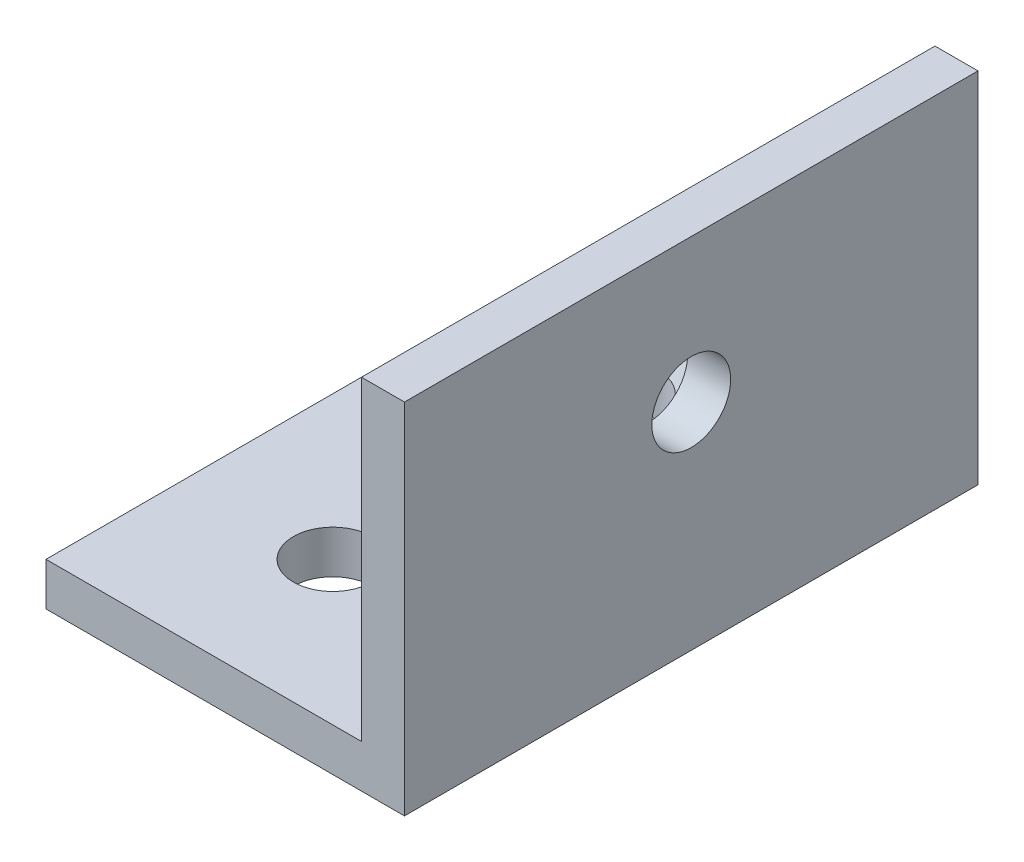
ISO-10303-21;
HEADER;
FILE_DESCRIPTION(('STEP AP214'),'2;1');
FILE_NAME('part.step','',(''),(''),'','','');
FILE_SCHEMA(('AUTOMOTIVE_DESIGN { 1 0 10303 214 1 1 1 1 }'));
ENDSEC;
DATA;
#1=APPLICATION_CONTEXT('core data for automotive mechanical design processes');
#2=APPLICATION_PROTOCOL_DEFINITION('international standard','automotive_design',2000,#1);
#3=PRODUCT_CONTEXT('',#1,'mechanical');
#4=PRODUCT('Part','Part','',(#3));
#5=PRODUCT_RELATED_PRODUCT_CATEGORY('part','',(#4));
#6=PRODUCT_DEFINITION_FORMATION('','',#4);
#7=PRODUCT_DEFINITION_CONTEXT('part definition',#1,'design');
#8=PRODUCT_DEFINITION('design','',#6,#7);
#9=PRODUCT_DEFINITION_SHAPE('','',#8);
#10=(LENGTH_UNIT() NAMED_UNIT(*) SI_UNIT(.MILLI.,.METRE.));
#11=(NAMED_UNIT(*) PLANE_ANGLE_UNIT() SI_UNIT($,.RADIAN.));
#12=(NAMED_UNIT(*) SI_UNIT($,.STERADIAN.) SOLID_ANGLE_UNIT());
#13=UNCERTAINTY_MEASURE_WITH_UNIT(LENGTH_MEASURE(1.E-05),#10,'distance_accuracy_value','');
#14=(GEOMETRIC_REPRESENTATION_CONTEXT(3) GLOBAL_UNCERTAINTY_ASSIGNED_CONTEXT((#13)) GLOBAL_UNIT_ASSIGNED_CONTEXT((#10,
#11,#12)) REPRESENTATION_CONTEXT('',''));
#15=CARTESIAN_POINT('',(0.,0.,0.));
#16=DIRECTION('',(0.,0.,1.));
#17=DIRECTION('',(1.,0.,0.));
#18=AXIS2_PLACEMENT_3D('',#15,#16,#17);
#19=CARTESIAN_POINT('',(-25.,0.,40.));
#20=DIRECTION('',(0.,1.,0.));
#21=DIRECTION('',(0.,0.,1.));
#22=AXIS2_PLACEMENT_3D('',#19,#20,#21);
#23=PLANE('',#22);
#24=CARTESIAN_POINT('',(-15.,0.,10.));
#25=DIRECTION('',(0.,1.,0.));
#26=DIRECTION('',(-1.,0.,0.));
#27=AXIS2_PLACEMENT_3D('',#24,#25,#26);
#28=CIRCLE('',#27,2.75);
#29=CARTESIAN_POINT('',(-17.75,0.,10.));
#30=VERTEX_POINT('',#29);
#31=EDGE_CURVE('E133',#30,#30,#28,.T.);
#32=ORIENTED_EDGE('',*,*,#31,.T.);
#33=EDGE_LOOP('',(#32));
#34=FACE_BOUND('',#33,.T.);
#35=CARTESIAN_POINT('',(-15.,0.,30.));
#36=DIRECTION('',(0.,1.,0.));
#37=DIRECTION('',(1.,0.,0.));
#38=AXIS2_PLACEMENT_3D('',#35,#36,#37);
#39=CIRCLE('',#38,2.75);
#40=CARTESIAN_POINT('',(-12.25,0.,30.));
#41=VERTEX_POINT('',#40);
#42=EDGE_CURVE('E185',#41,#41,#39,.T.);
#43=ORIENTED_EDGE('',*,*,#42,.T.);
#44=EDGE_LOOP('',(#43));
#45=FACE_BOUND('',#44,.T.);
#46=DIRECTION('',(1.,0.,0.));
#47=VECTOR('',#46,1.);
#48=CARTESIAN_POINT('',(-25.,0.,0.));
#49=LINE('',#48,#47);
#50=CARTESIAN_POINT('',(-25.,0.,0.));
#51=VERTEX_POINT('',#50);
#52=CARTESIAN_POINT('',(0.,0.,0.));
#53=VERTEX_POINT('',#52);
#54=EDGE_CURVE('E128',#51,#53,#49,.T.);
#55=ORIENTED_EDGE('',*,*,#54,.T.);
#56=DIRECTION('',(0.,0.,-1.));
#57=VECTOR('',#56,1.);
#58=CARTESIAN_POINT('',(0.,0.,40.));
#59=LINE('',#58,#57);
#60=CARTESIAN_POINT('',(0.,0.,40.));
#61=VERTEX_POINT('',#60);
#62=EDGE_CURVE('E11',#61,#53,#59,.T.);
#63=ORIENTED_EDGE('',*,*,#62,.F.);
#64=DIRECTION('',(1.,0.,0.));
#65=VECTOR('',#64,1.);
#66=CARTESIAN_POINT('',(-25.,0.,40.));
#67=LINE('',#66,#65);
#68=CARTESIAN_POINT('',(-25.,0.,40.));
#69=VERTEX_POINT('',#68);
#70=EDGE_CURVE('E145',#69,#61,#67,.T.);
#71=ORIENTED_EDGE('',*,*,#70,.F.);
#72=DIRECTION('',(0.,0.,-1.));
#73=VECTOR('',#72,1.);
#74=CARTESIAN_POINT('',(-25.,0.,40.));
#75=LINE('',#74,#73);
#76=EDGE_CURVE('E124',#69,#51,#75,.T.);
#77=ORIENTED_EDGE('',*,*,#76,.T.);
#78=EDGE_LOOP('',(#55,#63,#71,#77));
#79=FACE_BOUND('',#78,.T.);
#80=ADVANCED_FACE('F39',(#34,#45,#79),#23,.F.);
#81=CARTESIAN_POINT('',(0.,0.,40.));
#82=DIRECTION('',(-1.,0.,0.));
#83=DIRECTION('',(0.,0.,1.));
#84=AXIS2_PLACEMENT_3D('',#81,#82,#83);
#85=PLANE('',#84);
#86=CARTESIAN_POINT('',(0.,15.,20.));
#87=DIRECTION('',(-1.,0.,0.));
#88=DIRECTION('',(0.,0.,1.));
#89=AXIS2_PLACEMENT_3D('',#86,#87,#88);
#90=CIRCLE('',#89,2.75);
#91=CARTESIAN_POINT('',(0.,15.,22.75));
#92=VERTEX_POINT('',#91);
#93=EDGE_CURVE('E196',#92,#92,#90,.T.);
#94=ORIENTED_EDGE('',*,*,#93,.T.);
#95=EDGE_LOOP('',(#94));
#96=FACE_BOUND('',#95,.T.);
#97=DIRECTION('',(0.,1.,0.));
#98=VECTOR('',#97,1.);
#99=CARTESIAN_POINT('',(0.,0.,0.));
#100=LINE('',#99,#98);
#101=CARTESIAN_POINT('',(0.,25.,0.));
#102=VERTEX_POINT('',#101);
#103=EDGE_CURVE('E132',#53,#102,#100,.T.);
#104=ORIENTED_EDGE('',*,*,#103,.T.);
#105=DIRECTION('',(0.,0.,-1.));
#106=VECTOR('',#105,1.);
#107=CARTESIAN_POINT('',(0.,25.,40.));
#108=LINE('',#107,#106);
#109=CARTESIAN_POINT('',(0.,25.,40.));
#110=VERTEX_POINT('',#109);
#111=EDGE_CURVE('E48',#110,#102,#108,.T.);
#112=ORIENTED_EDGE('',*,*,#111,.F.);
#113=DIRECTION('',(0.,1.,0.));
#114=VECTOR('',#113,1.);
#115=CARTESIAN_POINT('',(0.,0.,40.));
#116=LINE('',#115,#114);
#117=EDGE_CURVE('E93',#61,#110,#116,.T.);
#118=ORIENTED_EDGE('',*,*,#117,.F.);
#119=ORIENTED_EDGE('',*,*,#62,.T.);
#120=EDGE_LOOP('',(#104,#112,#118,#119));
#121=FACE_BOUND('',#120,.T.);
#122=ADVANCED_FACE('F174',(#96,#121),#85,.F.);
#123=CARTESIAN_POINT('',(0.,25.,40.));
#124=DIRECTION('',(0.,-1.,0.));
#125=DIRECTION('',(0.,0.,-1.));
#126=AXIS2_PLACEMENT_3D('',#123,#124,#125);
#127=PLANE('',#126);
#128=DIRECTION('',(-1.,0.,0.));
#129=VECTOR('',#128,1.);
#130=CARTESIAN_POINT('',(0.,25.,0.));
#131=LINE('',#130,#129);
#132=CARTESIAN_POINT('',(-3.,25.,0.));
#133=VERTEX_POINT('',#132);
#134=EDGE_CURVE('E136',#102,#133,#131,.T.);
#135=ORIENTED_EDGE('',*,*,#134,.T.);
#136=DIRECTION('',(0.,0.,-1.));
#137=VECTOR('',#136,1.);
#138=CARTESIAN_POINT('',(-3.,25.,40.));
#139=LINE('',#138,#137);
#140=CARTESIAN_POINT('',(-3.,25.,40.));
#141=VERTEX_POINT('',#140);
#142=EDGE_CURVE('E117',#141,#133,#139,.T.);
#143=ORIENTED_EDGE('',*,*,#142,.F.);
#144=DIRECTION('',(-1.,0.,0.));
#145=VECTOR('',#144,1.);
#146=CARTESIAN_POINT('',(0.,25.,40.));
#147=LINE('',#146,#145);
#148=EDGE_CURVE('E106',#110,#141,#147,.T.);
#149=ORIENTED_EDGE('',*,*,#148,.F.);
#150=ORIENTED_EDGE('',*,*,#111,.T.);
#151=EDGE_LOOP('',(#135,#143,#149,#150));
#152=FACE_BOUND('',#151,.T.);
#153=ADVANCED_FACE('F155',(#152),#127,.F.);
#154=CARTESIAN_POINT('',(-3.,25.,40.));
#155=DIRECTION('',(1.,0.,0.));
#156=DIRECTION('',(0.,1.,0.));
#157=AXIS2_PLACEMENT_3D('',#154,#155,#156);
#158=PLANE('',#157);
#159=CARTESIAN_POINT('',(-3.,15.,20.));
#160=DIRECTION('',(-1.,0.,0.));
#161=DIRECTION('',(0.,0.,1.));
#162=AXIS2_PLACEMENT_3D('',#159,#160,#161);
#163=CIRCLE('',#162,2.75);
#164=CARTESIAN_POINT('',(-3.,15.,22.75));
#165=VERTEX_POINT('',#164);
#166=EDGE_CURVE('E209',#165,#165,#163,.T.);
#167=ORIENTED_EDGE('',*,*,#166,.F.);
#168=EDGE_LOOP('',(#167));
#169=FACE_BOUND('',#168,.T.);
#170=DIRECTION('',(0.,-1.,0.));
#171=VECTOR('',#170,1.);
#172=CARTESIAN_POINT('',(-3.,25.,0.));
#173=LINE('',#172,#171);
#174=CARTESIAN_POINT('',(-3.,3.,0.));
#175=VERTEX_POINT('',#174);
#176=EDGE_CURVE('E115',#133,#175,#173,.T.);
#177=ORIENTED_EDGE('',*,*,#176,.T.);
#178=DIRECTION('',(0.,0.,-1.));
#179=VECTOR('',#178,1.);
#180=CARTESIAN_POINT('',(-3.,3.,40.));
#181=LINE('',#180,#179);
#182=CARTESIAN_POINT('',(-3.,3.,40.));
#183=VERTEX_POINT('',#182);
#184=EDGE_CURVE('E112',#183,#175,#181,.T.);
#185=ORIENTED_EDGE('',*,*,#184,.F.);
#186=DIRECTION('',(0.,-1.,0.));
#187=VECTOR('',#186,1.);
#188=CARTESIAN_POINT('',(-3.,25.,40.));
#189=LINE('',#188,#187);
#190=EDGE_CURVE('E100',#141,#183,#189,.T.);
#191=ORIENTED_EDGE('',*,*,#190,.F.);
#192=ORIENTED_EDGE('',*,*,#142,.T.);
#193=EDGE_LOOP('',(#177,#185,#191,#192));
#194=FACE_BOUND('',#193,.T.);
#195=ADVANCED_FACE('F113',(#169,#194),#158,.F.);
#196=CARTESIAN_POINT('',(-3.,3.,40.));
#197=DIRECTION('',(0.,-1.,0.));
#198=DIRECTION('',(1.,0.,0.));
#199=AXIS2_PLACEMENT_3D('',#196,#197,#198);
#200=PLANE('',#199);
#201=CARTESIAN_POINT('',(-15.,3.,10.));
#202=DIRECTION('',(0.,1.,0.));
#203=DIRECTION('',(-1.,0.,0.));
#204=AXIS2_PLACEMENT_3D('',#201,#202,#203);
#205=CIRCLE('',#204,2.75);
#206=CARTESIAN_POINT('',(-17.75,3.,10.));
#207=VERTEX_POINT('',#206);
#208=EDGE_CURVE('E188',#207,#207,#205,.T.);
#209=ORIENTED_EDGE('',*,*,#208,.F.);
#210=EDGE_LOOP('',(#209));
#211=FACE_BOUND('',#210,.T.);
#212=CARTESIAN_POINT('',(-15.,3.,30.));
#213=DIRECTION('',(0.,1.,0.));
#214=DIRECTION('',(1.,0.,0.));
#215=AXIS2_PLACEMENT_3D('',#212,#213,#214);
#216=CIRCLE('',#215,2.75);
#217=CARTESIAN_POINT('',(-12.25,3.,30.));
#218=VERTEX_POINT('',#217);
#219=EDGE_CURVE('E189',#218,#218,#216,.T.);
#220=ORIENTED_EDGE('',*,*,#219,.F.);
#221=EDGE_LOOP('',(#220));
#222=FACE_BOUND('',#221,.T.);
#223=DIRECTION('',(-1.,0.,0.));
#224=VECTOR('',#223,1.);
#225=CARTESIAN_POINT('',(-3.,3.,0.));
#226=LINE('',#225,#224);
#227=CARTESIAN_POINT('',(-25.,3.,0.));
#228=VERTEX_POINT('',#227);
#229=EDGE_CURVE('E79',#175,#228,#226,.T.);
#230=ORIENTED_EDGE('',*,*,#229,.T.);
#231=DIRECTION('',(0.,0.,-1.));
#232=VECTOR('',#231,1.);
#233=CARTESIAN_POINT('',(-25.,3.,40.));
#234=LINE('',#233,#232);
#235=CARTESIAN_POINT('',(-25.,3.,40.));
#236=VERTEX_POINT('',#235);
#237=EDGE_CURVE('E118',#236,#228,#234,.T.);
#238=ORIENTED_EDGE('',*,*,#237,.F.);
#239=DIRECTION('',(-1.,0.,0.));
#240=VECTOR('',#239,1.);
#241=CARTESIAN_POINT('',(-3.,3.,40.));
#242=LINE('',#241,#240);
#243=EDGE_CURVE('E104',#183,#236,#242,.T.);
#244=ORIENTED_EDGE('',*,*,#243,.F.);
#245=ORIENTED_EDGE('',*,*,#184,.T.);
#246=EDGE_LOOP('',(#230,#238,#244,#245));
#247=FACE_BOUND('',#246,.T.);
#248=ADVANCED_FACE('F120',(#211,#222,#247),#200,.F.);
#249=CARTESIAN_POINT('',(-25.,3.,40.));
#250=DIRECTION('',(1.,0.,0.));
#251=DIRECTION('',(0.,0.,-1.));
#252=AXIS2_PLACEMENT_3D('',#249,#250,#251);
#253=PLANE('',#252);
#254=DIRECTION('',(0.,-1.,0.));
#255=VECTOR('',#254,1.);
#256=CARTESIAN_POINT('',(-25.,3.,0.));
#257=LINE('',#256,#255);
#258=EDGE_CURVE('E85',#228,#51,#257,.T.);
#259=ORIENTED_EDGE('',*,*,#258,.T.);
#260=ORIENTED_EDGE('',*,*,#76,.F.);
#261=DIRECTION('',(0.,-1.,0.));
#262=VECTOR('',#261,1.);
#263=CARTESIAN_POINT('',(-25.,3.,40.));
#264=LINE('',#263,#262);
#265=EDGE_CURVE('E56',#236,#69,#264,.T.);
#266=ORIENTED_EDGE('',*,*,#265,.F.);
#267=ORIENTED_EDGE('',*,*,#237,.T.);
#268=EDGE_LOOP('',(#259,#260,#266,#267));
#269=FACE_BOUND('',#268,.T.);
#270=ADVANCED_FACE('F162',(#269),#253,.F.);
#271=CARTESIAN_POINT('',(0.,0.,40.));
#272=DIRECTION('',(0.,0.,1.));
#273=DIRECTION('',(1.,0.,0.));
#274=AXIS2_PLACEMENT_3D('',#271,#272,#273);
#275=PLANE('',#274);
#276=ORIENTED_EDGE('',*,*,#70,.T.);
#277=ORIENTED_EDGE('',*,*,#117,.T.);
#278=ORIENTED_EDGE('',*,*,#148,.T.);
#279=ORIENTED_EDGE('',*,*,#190,.T.);
#280=ORIENTED_EDGE('',*,*,#243,.T.);
#281=ORIENTED_EDGE('',*,*,#265,.T.);
#282=EDGE_LOOP('',(#276,#277,#278,#279,#280,#281));
#283=FACE_BOUND('',#282,.T.);
#284=ADVANCED_FACE('F102',(#283),#275,.T.);
#285=CARTESIAN_POINT('',(0.,0.,0.));
#286=DIRECTION('',(0.,0.,1.));
#287=DIRECTION('',(1.,0.,0.));
#288=AXIS2_PLACEMENT_3D('',#285,#286,#287);
#289=PLANE('',#288);
#290=ORIENTED_EDGE('',*,*,#54,.F.);
#291=ORIENTED_EDGE('',*,*,#258,.F.);
#292=ORIENTED_EDGE('',*,*,#229,.F.);
#293=ORIENTED_EDGE('',*,*,#176,.F.);
#294=ORIENTED_EDGE('',*,*,#134,.F.);
#295=ORIENTED_EDGE('',*,*,#103,.F.);
#296=EDGE_LOOP('',(#290,#291,#292,#293,#294,#295));
#297=FACE_BOUND('',#296,.T.);
#298=ADVANCED_FACE('F158',(#297),#289,.F.);
#299=CARTESIAN_POINT('',(-15.,0.,30.));
#300=DIRECTION('',(0.,1.,0.));
#301=DIRECTION('',(-1.,0.,0.));
#302=AXIS2_PLACEMENT_3D('',#299,#300,#301);
#303=CYLINDRICAL_SURFACE('',#302,2.75);
#304=ORIENTED_EDGE('',*,*,#42,.F.);
#305=EDGE_LOOP('',(#304));
#306=FACE_BOUND('',#305,.T.);
#307=ORIENTED_EDGE('',*,*,#219,.T.);
#308=EDGE_LOOP('',(#307));
#309=FACE_BOUND('',#308,.T.);
#310=ADVANCED_FACE('F255',(#306,#309),#303,.F.);
#311=CARTESIAN_POINT('',(-15.,0.,10.));
#312=DIRECTION('',(0.,1.,0.));
#313=DIRECTION('',(-1.,0.,0.));
#314=AXIS2_PLACEMENT_3D('',#311,#312,#313);
#315=CYLINDRICAL_SURFACE('',#314,2.75);
#316=ORIENTED_EDGE('',*,*,#31,.F.);
#317=EDGE_LOOP('',(#316));
#318=FACE_BOUND('',#317,.T.);
#319=ORIENTED_EDGE('',*,*,#208,.T.);
#320=EDGE_LOOP('',(#319));
#321=FACE_BOUND('',#320,.T.);
#322=ADVANCED_FACE('F234',(#318,#321),#315,.F.);
#323=CARTESIAN_POINT('',(-3.,15.,20.));
#324=DIRECTION('',(-1.,0.,0.));
#325=DIRECTION('',(0.,0.,1.));
#326=AXIS2_PLACEMENT_3D('',#323,#324,#325);
#327=CYLINDRICAL_SURFACE('',#326,2.75);
#328=ORIENTED_EDGE('',*,*,#93,.F.);
#329=EDGE_LOOP('',(#328));
#330=FACE_BOUND('',#329,.T.);
#331=ORIENTED_EDGE('',*,*,#166,.T.);
#332=EDGE_LOOP('',(#331));
#333=FACE_BOUND('',#332,.T.);
#334=ADVANCED_FACE('F214',(#330,#333),#327,.F.);
#335=CLOSED_SHELL('',(#80,#122,#153,#195,#248,#270,#284,#298,#310,#322,#334));
#336=MANIFOLD_SOLID_BREP('B2',#335);
#337=ADVANCED_BREP_SHAPE_REPRESENTATION('',(#18,#336),#14);
#338=SHAPE_DEFINITION_REPRESENTATION(#9,#337);
ENDSEC;
END-ISO-10303-21;
